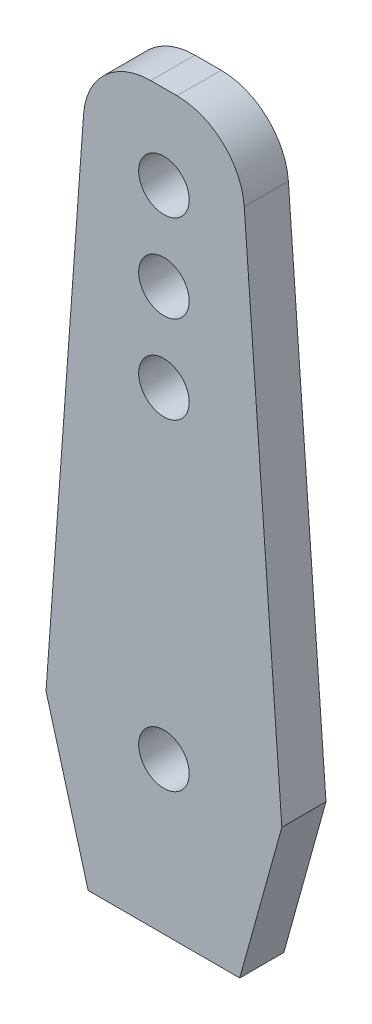
ISO-10303-21;
HEADER;
FILE_DESCRIPTION(('STEP AP214'),'2;1');
FILE_NAME('part.step','',(''),(''),'','','');
FILE_SCHEMA(('AUTOMOTIVE_DESIGN { 1 0 10303 214 1 1 1 1 }'));
ENDSEC;
DATA;
#1=APPLICATION_CONTEXT('core data for automotive mechanical design processes');
#2=APPLICATION_PROTOCOL_DEFINITION('international standard','automotive_design',2000,#1);
#3=PRODUCT_CONTEXT('',#1,'mechanical');
#4=PRODUCT('Part','Part','',(#3));
#5=PRODUCT_RELATED_PRODUCT_CATEGORY('part','',(#4));
#6=PRODUCT_DEFINITION_FORMATION('','',#4);
#7=PRODUCT_DEFINITION_CONTEXT('part definition',#1,'design');
#8=PRODUCT_DEFINITION('design','',#6,#7);
#9=PRODUCT_DEFINITION_SHAPE('','',#8);
#10=(LENGTH_UNIT() NAMED_UNIT(*) SI_UNIT(.MILLI.,.METRE.));
#11=(NAMED_UNIT(*) PLANE_ANGLE_UNIT() SI_UNIT($,.RADIAN.));
#12=(NAMED_UNIT(*) SI_UNIT($,.STERADIAN.) SOLID_ANGLE_UNIT());
#13=UNCERTAINTY_MEASURE_WITH_UNIT(LENGTH_MEASURE(1.E-05),#10,'distance_accuracy_value','');
#14=(GEOMETRIC_REPRESENTATION_CONTEXT(3) GLOBAL_UNCERTAINTY_ASSIGNED_CONTEXT((#13)) GLOBAL_UNIT_ASSIGNED_CONTEXT((#10,
#11,#12)) REPRESENTATION_CONTEXT('',''));
#15=CARTESIAN_POINT('',(0.,0.,0.));
#16=DIRECTION('',(0.,0.,1.));
#17=DIRECTION('',(1.,0.,0.));
#18=AXIS2_PLACEMENT_3D('',#15,#16,#17);
#19=CARTESIAN_POINT('',(-0.779366827494962,30.5,2.62));
#20=DIRECTION('',(0.,0.,-1.));
#21=DIRECTION('',(-1.,0.,0.));
#22=AXIS2_PLACEMENT_3D('',#19,#20,#21);
#23=PLANE('',#22);
#24=DIRECTION('',(0.267643863786095,0.963517909629941,0.));
#25=VECTOR('',#24,1.);
#26=CARTESIAN_POINT('',(7.,0.,2.62));
#27=LINE('',#26,#25);
#28=CARTESIAN_POINT('',(4.5,-9.,2.62));
#29=VERTEX_POINT('',#28);
#30=CARTESIAN_POINT('',(7.,0.,2.62));
#31=VERTEX_POINT('',#30);
#32=EDGE_CURVE('E145',#29,#31,#27,.T.);
#33=ORIENTED_EDGE('',*,*,#32,.T.);
#34=DIRECTION('',(-0.0722742605784705,0.997384795982892,0.));
#35=VECTOR('',#34,1.);
#36=CARTESIAN_POINT('',(4.76890601142653,30.7890970423139,2.62));
#37=LINE('',#36,#35);
#38=CARTESIAN_POINT('',(4.76890601142653,30.7890970423139,2.62));
#39=VERTEX_POINT('',#38);
#40=EDGE_CURVE('E93',#31,#39,#37,.T.);
#41=ORIENTED_EDGE('',*,*,#40,.T.);
#42=CARTESIAN_POINT('',(0.779366827494962,30.5,2.62));
#43=DIRECTION('',(0.,0.,1.));
#44=DIRECTION('',(1.,0.,0.));
#45=AXIS2_PLACEMENT_3D('',#42,#43,#44);
#46=CIRCLE('',#45,4.);
#47=CARTESIAN_POINT('',(0.779366827494934,34.5,2.62));
#48=VERTEX_POINT('',#47);
#49=EDGE_CURVE('E160',#39,#48,#46,.T.);
#50=ORIENTED_EDGE('',*,*,#49,.T.);
#51=DIRECTION('',(-1.,0.,0.));
#52=VECTOR('',#51,1.);
#53=CARTESIAN_POINT('',(-0.779366827494935,34.5,2.62));
#54=LINE('',#53,#52);
#55=CARTESIAN_POINT('',(-0.779366827494935,34.5,2.62));
#56=VERTEX_POINT('',#55);
#57=EDGE_CURVE('E173',#48,#56,#54,.T.);
#58=ORIENTED_EDGE('',*,*,#57,.T.);
#59=CARTESIAN_POINT('',(-0.779366827494962,30.5,2.62));
#60=DIRECTION('',(0.,0.,1.));
#61=DIRECTION('',(-1.,0.,0.));
#62=AXIS2_PLACEMENT_3D('',#59,#60,#61);
#63=CIRCLE('',#62,4.);
#64=CARTESIAN_POINT('',(-4.76890601142653,30.7890970423139,2.62));
#65=VERTEX_POINT('',#64);
#66=EDGE_CURVE('E112',#56,#65,#63,.T.);
#67=ORIENTED_EDGE('',*,*,#66,.T.);
#68=DIRECTION('',(-0.0722742605784705,-0.997384795982892,0.));
#69=VECTOR('',#68,1.);
#70=CARTESIAN_POINT('',(-4.76890601142653,30.7890970423139,2.62));
#71=LINE('',#70,#69);
#72=CARTESIAN_POINT('',(-7.,0.,2.62));
#73=VERTEX_POINT('',#72);
#74=EDGE_CURVE('E106',#65,#73,#71,.T.);
#75=ORIENTED_EDGE('',*,*,#74,.T.);
#76=DIRECTION('',(0.267643863786095,-0.963517909629941,0.));
#77=VECTOR('',#76,1.);
#78=CARTESIAN_POINT('',(-7.,0.,2.62));
#79=LINE('',#78,#77);
#80=CARTESIAN_POINT('',(-4.5,-9.,2.62));
#81=VERTEX_POINT('',#80);
#82=EDGE_CURVE('E110',#73,#81,#79,.T.);
#83=ORIENTED_EDGE('',*,*,#82,.T.);
#84=DIRECTION('',(1.,0.,0.));
#85=VECTOR('',#84,1.);
#86=CARTESIAN_POINT('',(-4.5,-9.,2.62));
#87=LINE('',#86,#85);
#88=EDGE_CURVE('E50',#81,#29,#87,.T.);
#89=ORIENTED_EDGE('',*,*,#88,.T.);
#90=EDGE_LOOP('',(#33,#41,#50,#58,#67,#75,#83,#89));
#91=FACE_BOUND('',#90,.T.);
#92=CARTESIAN_POINT('',(0.,0.,2.62));
#93=DIRECTION('',(0.,0.,1.));
#94=DIRECTION('',(1.,0.,0.));
#95=AXIS2_PLACEMENT_3D('',#92,#93,#94);
#96=CIRCLE('',#95,1.5);
#97=CARTESIAN_POINT('',(1.5,0.,2.62));
#98=VERTEX_POINT('',#97);
#99=EDGE_CURVE('E134',#98,#98,#96,.T.);
#100=ORIENTED_EDGE('',*,*,#99,.F.);
#101=EDGE_LOOP('',(#100));
#102=FACE_BOUND('',#101,.T.);
#103=CARTESIAN_POINT('',(0.,19.1,2.62));
#104=DIRECTION('',(0.,0.,1.));
#105=DIRECTION('',(1.,0.,0.));
#106=AXIS2_PLACEMENT_3D('',#103,#104,#105);
#107=CIRCLE('',#106,1.5);
#108=CARTESIAN_POINT('',(1.5,19.1,2.62));
#109=VERTEX_POINT('',#108);
#110=EDGE_CURVE('E182',#109,#109,#107,.T.);
#111=ORIENTED_EDGE('',*,*,#110,.F.);
#112=EDGE_LOOP('',(#111));
#113=FACE_BOUND('',#112,.T.);
#114=CARTESIAN_POINT('',(0.,24.3,2.62));
#115=DIRECTION('',(0.,0.,1.));
#116=DIRECTION('',(1.,0.,0.));
#117=AXIS2_PLACEMENT_3D('',#114,#115,#116);
#118=CIRCLE('',#117,1.5);
#119=CARTESIAN_POINT('',(1.5,24.3,2.62));
#120=VERTEX_POINT('',#119);
#121=EDGE_CURVE('E188',#120,#120,#118,.T.);
#122=ORIENTED_EDGE('',*,*,#121,.F.);
#123=EDGE_LOOP('',(#122));
#124=FACE_BOUND('',#123,.T.);
#125=CARTESIAN_POINT('',(0.,29.5,2.62));
#126=DIRECTION('',(0.,0.,1.));
#127=DIRECTION('',(1.,0.,0.));
#128=AXIS2_PLACEMENT_3D('',#125,#126,#127);
#129=CIRCLE('',#128,1.5);
#130=CARTESIAN_POINT('',(1.5,29.5,2.62));
#131=VERTEX_POINT('',#130);
#132=EDGE_CURVE('E194',#131,#131,#129,.T.);
#133=ORIENTED_EDGE('',*,*,#132,.F.);
#134=EDGE_LOOP('',(#133));
#135=FACE_BOUND('',#134,.T.);
#136=ADVANCED_FACE('F33',(#91,#102,#113,#124,#135),#23,.F.);
#137=CARTESIAN_POINT('',(-0.779366827494962,30.5,0.));
#138=DIRECTION('',(0.,0.,-1.));
#139=DIRECTION('',(-1.,0.,0.));
#140=AXIS2_PLACEMENT_3D('',#137,#138,#139);
#141=PLANE('',#140);
#142=CARTESIAN_POINT('',(0.,24.3,0.));
#143=DIRECTION('',(0.,0.,1.));
#144=DIRECTION('',(1.,0.,0.));
#145=AXIS2_PLACEMENT_3D('',#142,#143,#144);
#146=CIRCLE('',#145,1.5);
#147=CARTESIAN_POINT('',(1.5,24.3,0.));
#148=VERTEX_POINT('',#147);
#149=EDGE_CURVE('E191',#148,#148,#146,.T.);
#150=ORIENTED_EDGE('',*,*,#149,.T.);
#151=EDGE_LOOP('',(#150));
#152=FACE_BOUND('',#151,.T.);
#153=CARTESIAN_POINT('',(0.,0.,0.));
#154=DIRECTION('',(0.,0.,1.));
#155=DIRECTION('',(1.,0.,0.));
#156=AXIS2_PLACEMENT_3D('',#153,#154,#155);
#157=CIRCLE('',#156,1.5);
#158=CARTESIAN_POINT('',(1.5,0.,0.));
#159=VERTEX_POINT('',#158);
#160=EDGE_CURVE('E179',#159,#159,#157,.T.);
#161=ORIENTED_EDGE('',*,*,#160,.T.);
#162=EDGE_LOOP('',(#161));
#163=FACE_BOUND('',#162,.T.);
#164=DIRECTION('',(0.267643863786095,0.963517909629941,0.));
#165=VECTOR('',#164,1.);
#166=CARTESIAN_POINT('',(7.,0.,0.));
#167=LINE('',#166,#165);
#168=CARTESIAN_POINT('',(4.5,-9.,0.));
#169=VERTEX_POINT('',#168);
#170=CARTESIAN_POINT('',(7.,0.,0.));
#171=VERTEX_POINT('',#170);
#172=EDGE_CURVE('E130',#169,#171,#167,.T.);
#173=ORIENTED_EDGE('',*,*,#172,.F.);
#174=DIRECTION('',(1.,0.,0.));
#175=VECTOR('',#174,1.);
#176=CARTESIAN_POINT('',(-4.5,-9.,0.));
#177=LINE('',#176,#175);
#178=CARTESIAN_POINT('',(-4.5,-9.,0.));
#179=VERTEX_POINT('',#178);
#180=EDGE_CURVE('E85',#179,#169,#177,.T.);
#181=ORIENTED_EDGE('',*,*,#180,.F.);
#182=DIRECTION('',(0.267643863786095,-0.963517909629941,0.));
#183=VECTOR('',#182,1.);
#184=CARTESIAN_POINT('',(-7.,0.,0.));
#185=LINE('',#184,#183);
#186=CARTESIAN_POINT('',(-7.,0.,0.));
#187=VERTEX_POINT('',#186);
#188=EDGE_CURVE('E79',#187,#179,#185,.T.);
#189=ORIENTED_EDGE('',*,*,#188,.F.);
#190=DIRECTION('',(-0.0722742605784705,-0.997384795982892,0.));
#191=VECTOR('',#190,1.);
#192=CARTESIAN_POINT('',(-4.76890601142653,30.7890970423139,0.));
#193=LINE('',#192,#191);
#194=CARTESIAN_POINT('',(-4.76890601142653,30.7890970423139,0.));
#195=VERTEX_POINT('',#194);
#196=EDGE_CURVE('E120',#195,#187,#193,.T.);
#197=ORIENTED_EDGE('',*,*,#196,.F.);
#198=CARTESIAN_POINT('',(-0.779366827494962,30.5,0.));
#199=DIRECTION('',(0.,0.,1.));
#200=DIRECTION('',(-1.,0.,0.));
#201=AXIS2_PLACEMENT_3D('',#198,#199,#200);
#202=CIRCLE('',#201,4.);
#203=CARTESIAN_POINT('',(-0.779366827494935,34.5,0.));
#204=VERTEX_POINT('',#203);
#205=EDGE_CURVE('E140',#204,#195,#202,.T.);
#206=ORIENTED_EDGE('',*,*,#205,.F.);
#207=DIRECTION('',(-1.,0.,0.));
#208=VECTOR('',#207,1.);
#209=CARTESIAN_POINT('',(-0.779366827494935,34.5,0.));
#210=LINE('',#209,#208);
#211=CARTESIAN_POINT('',(0.779366827494934,34.5,0.));
#212=VERTEX_POINT('',#211);
#213=EDGE_CURVE('E138',#212,#204,#210,.T.);
#214=ORIENTED_EDGE('',*,*,#213,.F.);
#215=CARTESIAN_POINT('',(0.779366827494962,30.5,0.));
#216=DIRECTION('',(0.,0.,1.));
#217=DIRECTION('',(1.,0.,0.));
#218=AXIS2_PLACEMENT_3D('',#215,#216,#217);
#219=CIRCLE('',#218,4.);
#220=CARTESIAN_POINT('',(4.76890601142653,30.7890970423139,0.));
#221=VERTEX_POINT('',#220);
#222=EDGE_CURVE('E136',#221,#212,#219,.T.);
#223=ORIENTED_EDGE('',*,*,#222,.F.);
#224=DIRECTION('',(-0.0722742605784705,0.997384795982892,0.));
#225=VECTOR('',#224,1.);
#226=CARTESIAN_POINT('',(4.76890601142653,30.7890970423139,0.));
#227=LINE('',#226,#225);
#228=EDGE_CURVE('E133',#171,#221,#227,.T.);
#229=ORIENTED_EDGE('',*,*,#228,.F.);
#230=EDGE_LOOP('',(#173,#181,#189,#197,#206,#214,#223,#229));
#231=FACE_BOUND('',#230,.T.);
#232=CARTESIAN_POINT('',(0.,19.1,0.));
#233=DIRECTION('',(0.,0.,1.));
#234=DIRECTION('',(1.,0.,0.));
#235=AXIS2_PLACEMENT_3D('',#232,#233,#234);
#236=CIRCLE('',#235,1.5);
#237=CARTESIAN_POINT('',(1.5,19.1,0.));
#238=VERTEX_POINT('',#237);
#239=EDGE_CURVE('E185',#238,#238,#236,.T.);
#240=ORIENTED_EDGE('',*,*,#239,.T.);
#241=EDGE_LOOP('',(#240));
#242=FACE_BOUND('',#241,.T.);
#243=CARTESIAN_POINT('',(0.,29.5,0.));
#244=DIRECTION('',(0.,0.,1.));
#245=DIRECTION('',(1.,0.,0.));
#246=AXIS2_PLACEMENT_3D('',#243,#244,#245);
#247=CIRCLE('',#246,1.5);
#248=CARTESIAN_POINT('',(1.5,29.5,0.));
#249=VERTEX_POINT('',#248);
#250=EDGE_CURVE('E197',#249,#249,#247,.T.);
#251=ORIENTED_EDGE('',*,*,#250,.T.);
#252=EDGE_LOOP('',(#251));
#253=FACE_BOUND('',#252,.T.);
#254=ADVANCED_FACE('F164',(#152,#163,#231,#242,#253),#141,.T.);
#255=CARTESIAN_POINT('',(7.,0.,2.62));
#256=DIRECTION('',(-0.963517909629941,0.267643863786095,0.));
#257=DIRECTION('',(-0.267643863786095,-0.963517909629941,0.));
#258=AXIS2_PLACEMENT_3D('',#255,#256,#257);
#259=PLANE('',#258);
#260=ORIENTED_EDGE('',*,*,#172,.T.);
#261=DIRECTION('',(0.,0.,-1.));
#262=VECTOR('',#261,1.);
#263=CARTESIAN_POINT('',(7.,0.,2.62));
#264=LINE('',#263,#262);
#265=EDGE_CURVE('E11',#31,#171,#264,.T.);
#266=ORIENTED_EDGE('',*,*,#265,.F.);
#267=ORIENTED_EDGE('',*,*,#32,.F.);
#268=DIRECTION('',(0.,0.,-1.));
#269=VECTOR('',#268,1.);
#270=CARTESIAN_POINT('',(4.5,-9.,2.62));
#271=LINE('',#270,#269);
#272=EDGE_CURVE('E126',#29,#169,#271,.T.);
#273=ORIENTED_EDGE('',*,*,#272,.T.);
#274=EDGE_LOOP('',(#260,#266,#267,#273));
#275=FACE_BOUND('',#274,.T.);
#276=ADVANCED_FACE('F35',(#275),#259,.F.);
#277=CARTESIAN_POINT('',(4.76890601142653,30.7890970423139,2.62));
#278=DIRECTION('',(-0.997384795982892,-0.0722742605784705,0.));
#279=DIRECTION('',(0.0722742605784705,-0.997384795982892,0.));
#280=AXIS2_PLACEMENT_3D('',#277,#278,#279);
#281=PLANE('',#280);
#282=ORIENTED_EDGE('',*,*,#228,.T.);
#283=DIRECTION('',(0.,0.,-1.));
#284=VECTOR('',#283,1.);
#285=CARTESIAN_POINT('',(4.76890601142653,30.7890970423139,2.62));
#286=LINE('',#285,#284);
#287=EDGE_CURVE('E42',#39,#221,#286,.T.);
#288=ORIENTED_EDGE('',*,*,#287,.F.);
#289=ORIENTED_EDGE('',*,*,#40,.F.);
#290=ORIENTED_EDGE('',*,*,#265,.T.);
#291=EDGE_LOOP('',(#282,#288,#289,#290));
#292=FACE_BOUND('',#291,.T.);
#293=ADVANCED_FACE('F229',(#292),#281,.F.);
#294=CARTESIAN_POINT('',(0.779366827494962,30.5,2.62));
#295=DIRECTION('',(0.,0.,-1.));
#296=DIRECTION('',(-1.,0.,0.));
#297=AXIS2_PLACEMENT_3D('',#294,#295,#296);
#298=CYLINDRICAL_SURFACE('',#297,4.);
#299=ORIENTED_EDGE('',*,*,#222,.T.);
#300=DIRECTION('',(0.,0.,-1.));
#301=VECTOR('',#300,1.);
#302=CARTESIAN_POINT('',(0.779366827494934,34.5,2.62));
#303=LINE('',#302,#301);
#304=EDGE_CURVE('E152',#48,#212,#303,.T.);
#305=ORIENTED_EDGE('',*,*,#304,.F.);
#306=ORIENTED_EDGE('',*,*,#49,.F.);
#307=ORIENTED_EDGE('',*,*,#287,.T.);
#308=EDGE_LOOP('',(#299,#305,#306,#307));
#309=FACE_BOUND('',#308,.T.);
#310=ADVANCED_FACE('F158',(#309),#298,.T.);
#311=CARTESIAN_POINT('',(-0.779366827494935,34.5,2.62));
#312=DIRECTION('',(0.,-1.,0.));
#313=DIRECTION('',(0.,0.,-1.));
#314=AXIS2_PLACEMENT_3D('',#311,#312,#313);
#315=PLANE('',#314);
#316=ORIENTED_EDGE('',*,*,#213,.T.);
#317=DIRECTION('',(0.,0.,-1.));
#318=VECTOR('',#317,1.);
#319=CARTESIAN_POINT('',(-0.779366827494935,34.5,2.62));
#320=LINE('',#319,#318);
#321=EDGE_CURVE('E149',#56,#204,#320,.T.);
#322=ORIENTED_EDGE('',*,*,#321,.F.);
#323=ORIENTED_EDGE('',*,*,#57,.F.);
#324=ORIENTED_EDGE('',*,*,#304,.T.);
#325=EDGE_LOOP('',(#316,#322,#323,#324));
#326=FACE_BOUND('',#325,.T.);
#327=ADVANCED_FACE('F169',(#326),#315,.F.);
#328=CARTESIAN_POINT('',(-0.779366827494962,30.5,2.62));
#329=DIRECTION('',(0.,0.,-1.));
#330=DIRECTION('',(-1.,0.,0.));
#331=AXIS2_PLACEMENT_3D('',#328,#329,#330);
#332=CYLINDRICAL_SURFACE('',#331,4.);
#333=ORIENTED_EDGE('',*,*,#205,.T.);
#334=DIRECTION('',(0.,0.,-1.));
#335=VECTOR('',#334,1.);
#336=CARTESIAN_POINT('',(-4.76890601142653,30.7890970423139,2.62));
#337=LINE('',#336,#335);
#338=EDGE_CURVE('E121',#65,#195,#337,.T.);
#339=ORIENTED_EDGE('',*,*,#338,.F.);
#340=ORIENTED_EDGE('',*,*,#66,.F.);
#341=ORIENTED_EDGE('',*,*,#321,.T.);
#342=EDGE_LOOP('',(#333,#339,#340,#341));
#343=FACE_BOUND('',#342,.T.);
#344=ADVANCED_FACE('F172',(#343),#332,.T.);
#345=CARTESIAN_POINT('',(-4.76890601142653,30.7890970423139,2.62));
#346=DIRECTION('',(0.997384795982892,-0.0722742605784705,0.));
#347=DIRECTION('',(0.0722742605784705,0.997384795982892,0.));
#348=AXIS2_PLACEMENT_3D('',#345,#346,#347);
#349=PLANE('',#348);
#350=ORIENTED_EDGE('',*,*,#196,.T.);
#351=DIRECTION('',(0.,0.,-1.));
#352=VECTOR('',#351,1.);
#353=CARTESIAN_POINT('',(-7.,0.,2.62));
#354=LINE('',#353,#352);
#355=EDGE_CURVE('E117',#73,#187,#354,.T.);
#356=ORIENTED_EDGE('',*,*,#355,.F.);
#357=ORIENTED_EDGE('',*,*,#74,.F.);
#358=ORIENTED_EDGE('',*,*,#338,.T.);
#359=EDGE_LOOP('',(#350,#356,#357,#358));
#360=FACE_BOUND('',#359,.T.);
#361=ADVANCED_FACE('F118',(#360),#349,.F.);
#362=CARTESIAN_POINT('',(-7.,0.,2.62));
#363=DIRECTION('',(0.963517909629941,0.267643863786095,0.));
#364=DIRECTION('',(-0.267643863786095,0.963517909629941,0.));
#365=AXIS2_PLACEMENT_3D('',#362,#363,#364);
#366=PLANE('',#365);
#367=ORIENTED_EDGE('',*,*,#188,.T.);
#368=DIRECTION('',(0.,0.,-1.));
#369=VECTOR('',#368,1.);
#370=CARTESIAN_POINT('',(-4.5,-9.,2.62));
#371=LINE('',#370,#369);
#372=EDGE_CURVE('E122',#81,#179,#371,.T.);
#373=ORIENTED_EDGE('',*,*,#372,.F.);
#374=ORIENTED_EDGE('',*,*,#82,.F.);
#375=ORIENTED_EDGE('',*,*,#355,.T.);
#376=EDGE_LOOP('',(#367,#373,#374,#375));
#377=FACE_BOUND('',#376,.T.);
#378=ADVANCED_FACE('F124',(#377),#366,.F.);
#379=CARTESIAN_POINT('',(-4.5,-9.,2.62));
#380=DIRECTION('',(0.,1.,0.));
#381=DIRECTION('',(0.,0.,1.));
#382=AXIS2_PLACEMENT_3D('',#379,#380,#381);
#383=PLANE('',#382);
#384=ORIENTED_EDGE('',*,*,#180,.T.);
#385=ORIENTED_EDGE('',*,*,#272,.F.);
#386=ORIENTED_EDGE('',*,*,#88,.F.);
#387=ORIENTED_EDGE('',*,*,#372,.T.);
#388=EDGE_LOOP('',(#384,#385,#386,#387));
#389=FACE_BOUND('',#388,.T.);
#390=ADVANCED_FACE('F217',(#389),#383,.F.);
#391=CARTESIAN_POINT('',(0.,0.,2.62));
#392=DIRECTION('',(0.,0.,-1.));
#393=DIRECTION('',(-1.,0.,0.));
#394=AXIS2_PLACEMENT_3D('',#391,#392,#393);
#395=CYLINDRICAL_SURFACE('',#394,1.5);
#396=ORIENTED_EDGE('',*,*,#99,.T.);
#397=EDGE_LOOP('',(#396));
#398=FACE_BOUND('',#397,.T.);
#399=ORIENTED_EDGE('',*,*,#160,.F.);
#400=EDGE_LOOP('',(#399));
#401=FACE_BOUND('',#400,.T.);
#402=ADVANCED_FACE('F214',(#398,#401),#395,.F.);
#403=CARTESIAN_POINT('',(0.,19.1,2.62));
#404=DIRECTION('',(0.,0.,-1.));
#405=DIRECTION('',(-1.,0.,0.));
#406=AXIS2_PLACEMENT_3D('',#403,#404,#405);
#407=CYLINDRICAL_SURFACE('',#406,1.5);
#408=ORIENTED_EDGE('',*,*,#110,.T.);
#409=EDGE_LOOP('',(#408));
#410=FACE_BOUND('',#409,.T.);
#411=ORIENTED_EDGE('',*,*,#239,.F.);
#412=EDGE_LOOP('',(#411));
#413=FACE_BOUND('',#412,.T.);
#414=ADVANCED_FACE('F293',(#410,#413),#407,.F.);
#415=CARTESIAN_POINT('',(0.,24.3,2.62));
#416=DIRECTION('',(0.,0.,-1.));
#417=DIRECTION('',(-1.,0.,0.));
#418=AXIS2_PLACEMENT_3D('',#415,#416,#417);
#419=CYLINDRICAL_SURFACE('',#418,1.5);
#420=ORIENTED_EDGE('',*,*,#121,.T.);
#421=EDGE_LOOP('',(#420));
#422=FACE_BOUND('',#421,.T.);
#423=ORIENTED_EDGE('',*,*,#149,.F.);
#424=EDGE_LOOP('',(#423));
#425=FACE_BOUND('',#424,.T.);
#426=ADVANCED_FACE('F301',(#422,#425),#419,.F.);
#427=CARTESIAN_POINT('',(0.,29.5,2.62));
#428=DIRECTION('',(0.,0.,-1.));
#429=DIRECTION('',(-1.,0.,0.));
#430=AXIS2_PLACEMENT_3D('',#427,#428,#429);
#431=CYLINDRICAL_SURFACE('',#430,1.5);
#432=ORIENTED_EDGE('',*,*,#132,.T.);
#433=EDGE_LOOP('',(#432));
#434=FACE_BOUND('',#433,.T.);
#435=ORIENTED_EDGE('',*,*,#250,.F.);
#436=EDGE_LOOP('',(#435));
#437=FACE_BOUND('',#436,.T.);
#438=ADVANCED_FACE('F203',(#434,#437),#431,.F.);
#439=CLOSED_SHELL('',(#136,#254,#276,#293,#310,#327,#344,#361,#378,#390,#402,#414,#426,#438));
#440=MANIFOLD_SOLID_BREP('B2',#439);
#441=ADVANCED_BREP_SHAPE_REPRESENTATION('',(#18,#440),#14);
#442=SHAPE_DEFINITION_REPRESENTATION(#9,#441);
ENDSEC;
END-ISO-10303-21;
